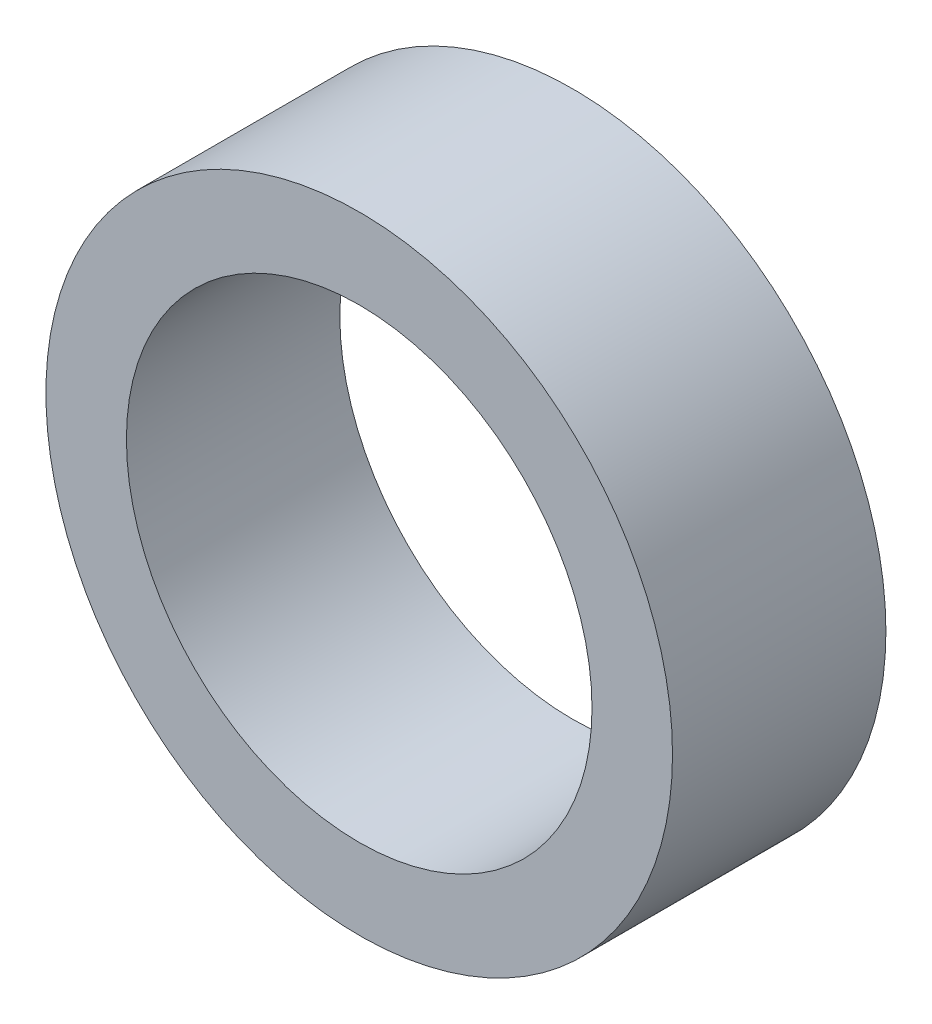
ISO-10303-21;
HEADER;
FILE_DESCRIPTION(('STEP AP214'),'2;1');
FILE_NAME('part.step','',(''),(''),'','','');
FILE_SCHEMA(('AUTOMOTIVE_DESIGN { 1 0 10303 214 1 1 1 1 }'));
ENDSEC;
DATA;
#1=APPLICATION_CONTEXT('core data for automotive mechanical design processes');
#2=APPLICATION_PROTOCOL_DEFINITION('international standard','automotive_design',2000,#1);
#3=PRODUCT_CONTEXT('',#1,'mechanical');
#4=PRODUCT('Part','Part','',(#3));
#5=PRODUCT_RELATED_PRODUCT_CATEGORY('part','',(#4));
#6=PRODUCT_DEFINITION_FORMATION('','',#4);
#7=PRODUCT_DEFINITION_CONTEXT('part definition',#1,'design');
#8=PRODUCT_DEFINITION('design','',#6,#7);
#9=PRODUCT_DEFINITION_SHAPE('','',#8);
#10=(LENGTH_UNIT() NAMED_UNIT(*) SI_UNIT(.MILLI.,.METRE.));
#11=(NAMED_UNIT(*) PLANE_ANGLE_UNIT() SI_UNIT($,.RADIAN.));
#12=(NAMED_UNIT(*) SI_UNIT($,.STERADIAN.) SOLID_ANGLE_UNIT());
#13=UNCERTAINTY_MEASURE_WITH_UNIT(LENGTH_MEASURE(1.E-05),#10,'distance_accuracy_value','');
#14=(GEOMETRIC_REPRESENTATION_CONTEXT(3) GLOBAL_UNCERTAINTY_ASSIGNED_CONTEXT((#13)) GLOBAL_UNIT_ASSIGNED_CONTEXT((#10,
#11,#12)) REPRESENTATION_CONTEXT('',''));
#15=CARTESIAN_POINT('',(0.,0.,0.));
#16=DIRECTION('',(0.,0.,1.));
#17=DIRECTION('',(1.,0.,0.));
#18=AXIS2_PLACEMENT_3D('',#15,#16,#17);
#19=CARTESIAN_POINT('',(0.,0.,5.5));
#20=DIRECTION('',(0.,0.,1.));
#21=DIRECTION('',(1.,0.,0.));
#22=AXIS2_PLACEMENT_3D('',#19,#20,#21);
#23=PLANE('',#22);
#24=CARTESIAN_POINT('',(0.,0.,5.5));
#25=DIRECTION('',(0.,0.,1.));
#26=DIRECTION('',(1.,0.,0.));
#27=AXIS2_PLACEMENT_3D('',#24,#25,#26);
#28=CIRCLE('',#27,8.075);
#29=CARTESIAN_POINT('',(8.075,0.,5.5));
#30=VERTEX_POINT('',#29);
#31=EDGE_CURVE('E10',#30,#30,#28,.T.);
#32=ORIENTED_EDGE('',*,*,#31,.T.);
#33=EDGE_LOOP('',(#32));
#34=FACE_BOUND('',#33,.T.);
#35=CARTESIAN_POINT('',(0.,0.,5.5));
#36=DIRECTION('',(0.,0.,1.));
#37=DIRECTION('',(1.,0.,0.));
#38=AXIS2_PLACEMENT_3D('',#35,#36,#37);
#39=CIRCLE('',#38,6.);
#40=CARTESIAN_POINT('',(6.,0.,5.5));
#41=VERTEX_POINT('',#40);
#42=EDGE_CURVE('E48',#41,#41,#39,.T.);
#43=ORIENTED_EDGE('',*,*,#42,.F.);
#44=EDGE_LOOP('',(#43));
#45=FACE_BOUND('',#44,.T.);
#46=ADVANCED_FACE('F37',(#34,#45),#23,.T.);
#47=CARTESIAN_POINT('',(0.,0.,0.));
#48=DIRECTION('',(0.,0.,1.));
#49=DIRECTION('',(1.,0.,0.));
#50=AXIS2_PLACEMENT_3D('',#47,#48,#49);
#51=PLANE('',#50);
#52=CARTESIAN_POINT('',(0.,0.,0.));
#53=DIRECTION('',(0.,0.,1.));
#54=DIRECTION('',(1.,0.,0.));
#55=AXIS2_PLACEMENT_3D('',#52,#53,#54);
#56=CIRCLE('',#55,8.075);
#57=CARTESIAN_POINT('',(8.075,0.,0.));
#58=VERTEX_POINT('',#57);
#59=EDGE_CURVE('E41',#58,#58,#56,.T.);
#60=ORIENTED_EDGE('',*,*,#59,.F.);
#61=EDGE_LOOP('',(#60));
#62=FACE_BOUND('',#61,.T.);
#63=CARTESIAN_POINT('',(0.,0.,0.));
#64=DIRECTION('',(0.,0.,1.));
#65=DIRECTION('',(1.,0.,0.));
#66=AXIS2_PLACEMENT_3D('',#63,#64,#65);
#67=CIRCLE('',#66,6.);
#68=CARTESIAN_POINT('',(6.,0.,0.));
#69=VERTEX_POINT('',#68);
#70=EDGE_CURVE('E50',#69,#69,#67,.T.);
#71=ORIENTED_EDGE('',*,*,#70,.T.);
#72=EDGE_LOOP('',(#71));
#73=FACE_BOUND('',#72,.T.);
#74=ADVANCED_FACE('F60',(#62,#73),#51,.F.);
#75=CARTESIAN_POINT('',(0.,0.,5.5));
#76=DIRECTION('',(0.,0.,-1.));
#77=DIRECTION('',(-1.,0.,0.));
#78=AXIS2_PLACEMENT_3D('',#75,#76,#77);
#79=CYLINDRICAL_SURFACE('',#78,8.075);
#80=ORIENTED_EDGE('',*,*,#31,.F.);
#81=EDGE_LOOP('',(#80));
#82=FACE_BOUND('',#81,.T.);
#83=ORIENTED_EDGE('',*,*,#59,.T.);
#84=EDGE_LOOP('',(#83));
#85=FACE_BOUND('',#84,.T.);
#86=ADVANCED_FACE('F39',(#82,#85),#79,.T.);
#87=CARTESIAN_POINT('',(0.,0.,5.5));
#88=DIRECTION('',(0.,0.,-1.));
#89=DIRECTION('',(-1.,0.,0.));
#90=AXIS2_PLACEMENT_3D('',#87,#88,#89);
#91=CYLINDRICAL_SURFACE('',#90,6.);
#92=ORIENTED_EDGE('',*,*,#42,.T.);
#93=EDGE_LOOP('',(#92));
#94=FACE_BOUND('',#93,.T.);
#95=ORIENTED_EDGE('',*,*,#70,.F.);
#96=EDGE_LOOP('',(#95));
#97=FACE_BOUND('',#96,.T.);
#98=ADVANCED_FACE('F56',(#94,#97),#91,.F.);
#99=CLOSED_SHELL('',(#46,#74,#86,#98));
#100=MANIFOLD_SOLID_BREP('B2',#99);
#101=ADVANCED_BREP_SHAPE_REPRESENTATION('',(#18,#100),#14);
#102=SHAPE_DEFINITION_REPRESENTATION(#9,#101);
ENDSEC;
END-ISO-10303-21;
